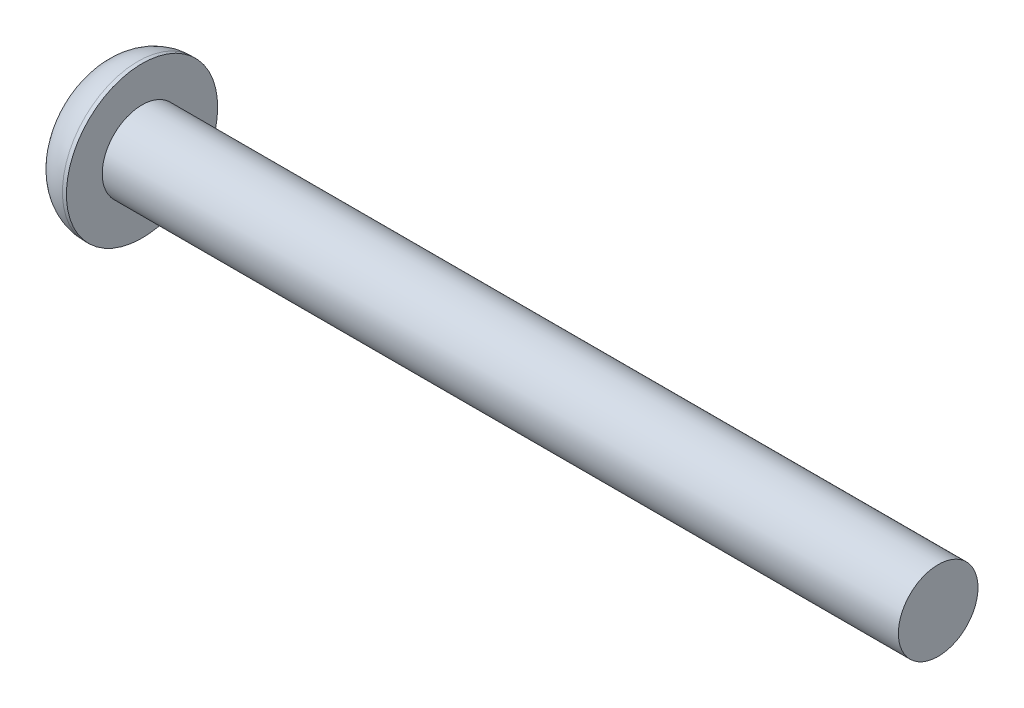
ISO-10303-21;
HEADER;
FILE_DESCRIPTION(('STEP AP214'),'2;1');
FILE_NAME('part.step','',(''),(''),'','','');
FILE_SCHEMA(('AUTOMOTIVE_DESIGN { 1 0 10303 214 1 1 1 1 }'));
ENDSEC;
DATA;
#1=APPLICATION_CONTEXT('core data for automotive mechanical design processes');
#2=APPLICATION_PROTOCOL_DEFINITION('international standard','automotive_design',2000,#1);
#3=PRODUCT_CONTEXT('',#1,'mechanical');
#4=PRODUCT('Part','Part','',(#3));
#5=PRODUCT_RELATED_PRODUCT_CATEGORY('part','',(#4));
#6=PRODUCT_DEFINITION_FORMATION('','',#4);
#7=PRODUCT_DEFINITION_CONTEXT('part definition',#1,'design');
#8=PRODUCT_DEFINITION('design','',#6,#7);
#9=PRODUCT_DEFINITION_SHAPE('','',#8);
#10=(LENGTH_UNIT() NAMED_UNIT(*) SI_UNIT(.MILLI.,.METRE.));
#11=(NAMED_UNIT(*) PLANE_ANGLE_UNIT() SI_UNIT($,.RADIAN.));
#12=(NAMED_UNIT(*) SI_UNIT($,.STERADIAN.) SOLID_ANGLE_UNIT());
#13=UNCERTAINTY_MEASURE_WITH_UNIT(LENGTH_MEASURE(1.E-05),#10,'distance_accuracy_value','');
#14=(GEOMETRIC_REPRESENTATION_CONTEXT(3) GLOBAL_UNCERTAINTY_ASSIGNED_CONTEXT((#13)) GLOBAL_UNIT_ASSIGNED_CONTEXT((#10,
#11,#12)) REPRESENTATION_CONTEXT('',''));
#15=CARTESIAN_POINT('',(0.,0.,0.));
#16=DIRECTION('',(0.,0.,1.));
#17=DIRECTION('',(1.,0.,0.));
#18=AXIS2_PLACEMENT_3D('',#15,#16,#17);
#19=CARTESIAN_POINT('',(0.,0.,-1.34999999999999));
#20=DIRECTION('',(-1.,0.,0.));
#21=DIRECTION('',(0.,0.,1.));
#22=AXIS2_PLACEMENT_3D('',#19,#20,#21);
#23=PLANE('',#22);
#24=DIRECTION('',(0.,0.866025403784439,0.5));
#25=VECTOR('',#24,1.);
#26=CARTESIAN_POINT('',(0.,-1.,0.577350269189626));
#27=LINE('',#26,#25);
#28=CARTESIAN_POINT('',(0.,-1.,0.577350269189626));
#29=VERTEX_POINT('',#28);
#30=CARTESIAN_POINT('',(0.,0.,1.15470053837925));
#31=VERTEX_POINT('',#30);
#32=EDGE_CURVE('E46',#29,#31,#27,.T.);
#33=ORIENTED_EDGE('',*,*,#32,.F.);
#34=DIRECTION('',(0.,0.,1.));
#35=VECTOR('',#34,1.);
#36=CARTESIAN_POINT('',(0.,-1.,-0.577350269189626));
#37=LINE('',#36,#35);
#38=CARTESIAN_POINT('',(0.,-1.,-0.577350269189626));
#39=VERTEX_POINT('',#38);
#40=EDGE_CURVE('E129',#39,#29,#37,.T.);
#41=ORIENTED_EDGE('',*,*,#40,.F.);
#42=DIRECTION('',(0.,-0.866025403784439,0.5));
#43=VECTOR('',#42,1.);
#44=CARTESIAN_POINT('',(0.,0.,-1.15470053837925));
#45=LINE('',#44,#43);
#46=CARTESIAN_POINT('',(0.,0.,-1.15470053837925));
#47=VERTEX_POINT('',#46);
#48=EDGE_CURVE('E127',#47,#39,#45,.T.);
#49=ORIENTED_EDGE('',*,*,#48,.F.);
#50=DIRECTION('',(0.,-0.866025403784439,-0.5));
#51=VECTOR('',#50,1.);
#52=CARTESIAN_POINT('',(0.,1.,-0.577350269189626));
#53=LINE('',#52,#51);
#54=CARTESIAN_POINT('',(0.,1.,-0.577350269189626));
#55=VERTEX_POINT('',#54);
#56=EDGE_CURVE('E94',#55,#47,#53,.T.);
#57=ORIENTED_EDGE('',*,*,#56,.F.);
#58=DIRECTION('',(0.,0.,-1.));
#59=VECTOR('',#58,1.);
#60=CARTESIAN_POINT('',(0.,1.,0.577350269189625));
#61=LINE('',#60,#59);
#62=CARTESIAN_POINT('',(0.,1.,0.577350269189625));
#63=VERTEX_POINT('',#62);
#64=EDGE_CURVE('E123',#63,#55,#61,.T.);
#65=ORIENTED_EDGE('',*,*,#64,.F.);
#66=DIRECTION('',(0.,0.866025403784439,-0.5));
#67=VECTOR('',#66,1.);
#68=CARTESIAN_POINT('',(0.,0.,1.15470053837925));
#69=LINE('',#68,#67);
#70=EDGE_CURVE('E120',#31,#63,#69,.T.);
#71=ORIENTED_EDGE('',*,*,#70,.F.);
#72=EDGE_LOOP('',(#33,#41,#49,#57,#65,#71));
#73=FACE_BOUND('',#72,.T.);
#74=CARTESIAN_POINT('',(0.,0.,0.));
#75=DIRECTION('',(1.,0.,0.));
#76=DIRECTION('',(0.,0.,-1.));
#77=AXIS2_PLACEMENT_3D('',#74,#75,#76);
#78=CIRCLE('',#77,1.34999999999999);
#79=CARTESIAN_POINT('',(0.,0.,-1.34999999999999));
#80=VERTEX_POINT('',#79);
#81=EDGE_CURVE('E11',#80,#80,#78,.T.);
#82=ORIENTED_EDGE('',*,*,#81,.F.);
#83=EDGE_LOOP('',(#82));
#84=FACE_BOUND('',#83,.T.);
#85=ADVANCED_FACE('F32',(#73,#84),#23,.T.);
#86=CARTESIAN_POINT('',(1.5,0.,0.));
#87=DIRECTION('',(1.,0.,0.));
#88=DIRECTION('',(0.,0.,-1.));
#89=AXIS2_PLACEMENT_3D('',#86,#87,#88);
#90=DEGENERATE_TOROIDAL_SURFACE('',#89,1.35,1.5,.T.);
#91=ORIENTED_EDGE('',*,*,#81,.T.);
#92=EDGE_LOOP('',(#91));
#93=FACE_BOUND('',#92,.T.);
#94=CARTESIAN_POINT('',(1.50000000000001,0.,0.));
#95=DIRECTION('',(1.,0.,0.));
#96=DIRECTION('',(0.,0.,-1.));
#97=AXIS2_PLACEMENT_3D('',#94,#95,#96);
#98=CIRCLE('',#97,2.85);
#99=CARTESIAN_POINT('',(1.50000000000001,0.,-2.85));
#100=VERTEX_POINT('',#99);
#101=EDGE_CURVE('E39',#100,#100,#98,.T.);
#102=ORIENTED_EDGE('',*,*,#101,.F.);
#103=EDGE_LOOP('',(#102));
#104=FACE_BOUND('',#103,.T.);
#105=ADVANCED_FACE('F152',(#93,#104),#90,.T.);
#106=CARTESIAN_POINT('',(0.,0.,0.));
#107=DIRECTION('',(1.,0.,0.));
#108=DIRECTION('',(0.,0.,-1.));
#109=AXIS2_PLACEMENT_3D('',#106,#107,#108);
#110=CYLINDRICAL_SURFACE('',#109,2.85);
#111=ORIENTED_EDGE('',*,*,#101,.T.);
#112=EDGE_LOOP('',(#111));
#113=FACE_BOUND('',#112,.T.);
#114=CARTESIAN_POINT('',(1.65,0.,0.));
#115=DIRECTION('',(1.,0.,0.));
#116=DIRECTION('',(0.,0.,-1.));
#117=AXIS2_PLACEMENT_3D('',#114,#115,#116);
#118=CIRCLE('',#117,2.85);
#119=CARTESIAN_POINT('',(1.65,0.,-2.85));
#120=VERTEX_POINT('',#119);
#121=EDGE_CURVE('E144',#120,#120,#118,.T.);
#122=ORIENTED_EDGE('',*,*,#121,.F.);
#123=EDGE_LOOP('',(#122));
#124=FACE_BOUND('',#123,.T.);
#125=ADVANCED_FACE('F149',(#113,#124),#110,.T.);
#126=CARTESIAN_POINT('',(1.65,0.,-1.5));
#127=DIRECTION('',(1.,0.,0.));
#128=DIRECTION('',(0.,0.,-1.));
#129=AXIS2_PLACEMENT_3D('',#126,#127,#128);
#130=PLANE('',#129);
#131=ORIENTED_EDGE('',*,*,#121,.T.);
#132=EDGE_LOOP('',(#131));
#133=FACE_BOUND('',#132,.T.);
#134=CARTESIAN_POINT('',(1.65,0.,0.));
#135=DIRECTION('',(1.,0.,0.));
#136=DIRECTION('',(0.,0.,-1.));
#137=AXIS2_PLACEMENT_3D('',#134,#135,#136);
#138=CIRCLE('',#137,1.5);
#139=CARTESIAN_POINT('',(1.65,0.,-1.5));
#140=VERTEX_POINT('',#139);
#141=EDGE_CURVE('E141',#140,#140,#138,.T.);
#142=ORIENTED_EDGE('',*,*,#141,.F.);
#143=EDGE_LOOP('',(#142));
#144=FACE_BOUND('',#143,.T.);
#145=ADVANCED_FACE('F159',(#133,#144),#130,.T.);
#146=CARTESIAN_POINT('',(0.,0.,0.));
#147=DIRECTION('',(1.,0.,0.));
#148=DIRECTION('',(0.,0.,-1.));
#149=AXIS2_PLACEMENT_3D('',#146,#147,#148);
#150=CYLINDRICAL_SURFACE('',#149,1.5);
#151=ORIENTED_EDGE('',*,*,#141,.T.);
#152=EDGE_LOOP('',(#151));
#153=FACE_BOUND('',#152,.T.);
#154=CARTESIAN_POINT('',(31.65,0.,0.));
#155=DIRECTION('',(1.,0.,0.));
#156=DIRECTION('',(0.,0.,-1.));
#157=AXIS2_PLACEMENT_3D('',#154,#155,#156);
#158=CIRCLE('',#157,1.5);
#159=CARTESIAN_POINT('',(31.65,0.,-1.5));
#160=VERTEX_POINT('',#159);
#161=EDGE_CURVE('E133',#160,#160,#158,.T.);
#162=ORIENTED_EDGE('',*,*,#161,.F.);
#163=EDGE_LOOP('',(#162));
#164=FACE_BOUND('',#163,.T.);
#165=ADVANCED_FACE('F165',(#153,#164),#150,.T.);
#166=CARTESIAN_POINT('',(31.65,0.,0.));
#167=DIRECTION('',(1.,0.,0.));
#168=DIRECTION('',(0.,0.,-1.));
#169=AXIS2_PLACEMENT_3D('',#166,#167,#168);
#170=PLANE('',#169);
#171=ORIENTED_EDGE('',*,*,#161,.T.);
#172=EDGE_LOOP('',(#171));
#173=FACE_BOUND('',#172,.T.);
#174=ADVANCED_FACE('F169',(#173),#170,.T.);
#175=CARTESIAN_POINT('',(1.04,-1.,0.577350269189626));
#176=DIRECTION('',(0.,-0.5,0.866025403784439));
#177=DIRECTION('',(0.,-0.866025403784439,-0.5));
#178=AXIS2_PLACEMENT_3D('',#175,#176,#177);
#179=PLANE('',#178);
#180=ORIENTED_EDGE('',*,*,#32,.T.);
#181=DIRECTION('',(-1.,0.,0.));
#182=VECTOR('',#181,1.);
#183=CARTESIAN_POINT('',(1.04,0.,1.15470053837925));
#184=LINE('',#183,#182);
#185=CARTESIAN_POINT('',(1.04,0.,1.15470053837925));
#186=VERTEX_POINT('',#185);
#187=EDGE_CURVE('E76',#186,#31,#184,.T.);
#188=ORIENTED_EDGE('',*,*,#187,.F.);
#189=DIRECTION('',(0.,0.866025403784439,0.5));
#190=VECTOR('',#189,1.);
#191=CARTESIAN_POINT('',(1.04,-1.,0.577350269189626));
#192=LINE('',#191,#190);
#193=CARTESIAN_POINT('',(1.04,-1.,0.577350269189626));
#194=VERTEX_POINT('',#193);
#195=EDGE_CURVE('E131',#194,#186,#192,.T.);
#196=ORIENTED_EDGE('',*,*,#195,.F.);
#197=DIRECTION('',(-1.,0.,0.));
#198=VECTOR('',#197,1.);
#199=CARTESIAN_POINT('',(1.04,-1.,0.577350269189626));
#200=LINE('',#199,#198);
#201=EDGE_CURVE('E54',#194,#29,#200,.T.);
#202=ORIENTED_EDGE('',*,*,#201,.T.);
#203=EDGE_LOOP('',(#180,#188,#196,#202));
#204=FACE_BOUND('',#203,.T.);
#205=ADVANCED_FACE('F173',(#204),#179,.F.);
#206=CARTESIAN_POINT('',(1.04,-1.,-0.577350269189626));
#207=DIRECTION('',(0.,-1.,0.));
#208=DIRECTION('',(0.,0.,-1.));
#209=AXIS2_PLACEMENT_3D('',#206,#207,#208);
#210=PLANE('',#209);
#211=ORIENTED_EDGE('',*,*,#40,.T.);
#212=ORIENTED_EDGE('',*,*,#201,.F.);
#213=DIRECTION('',(0.,0.,1.));
#214=VECTOR('',#213,1.);
#215=CARTESIAN_POINT('',(1.04,-1.,-0.577350269189626));
#216=LINE('',#215,#214);
#217=CARTESIAN_POINT('',(1.04,-1.,-0.577350269189626));
#218=VERTEX_POINT('',#217);
#219=EDGE_CURVE('E106',#218,#194,#216,.T.);
#220=ORIENTED_EDGE('',*,*,#219,.F.);
#221=DIRECTION('',(-1.,0.,0.));
#222=VECTOR('',#221,1.);
#223=CARTESIAN_POINT('',(1.04,-1.,-0.577350269189626));
#224=LINE('',#223,#222);
#225=EDGE_CURVE('E98',#218,#39,#224,.T.);
#226=ORIENTED_EDGE('',*,*,#225,.T.);
#227=EDGE_LOOP('',(#211,#212,#220,#226));
#228=FACE_BOUND('',#227,.T.);
#229=ADVANCED_FACE('F177',(#228),#210,.F.);
#230=CARTESIAN_POINT('',(1.04,0.,-1.15470053837925));
#231=DIRECTION('',(0.,-0.5,-0.866025403784439));
#232=DIRECTION('',(0.,0.866025403784439,-0.5));
#233=AXIS2_PLACEMENT_3D('',#230,#231,#232);
#234=PLANE('',#233);
#235=ORIENTED_EDGE('',*,*,#48,.T.);
#236=ORIENTED_EDGE('',*,*,#225,.F.);
#237=DIRECTION('',(0.,-0.866025403784439,0.5));
#238=VECTOR('',#237,1.);
#239=CARTESIAN_POINT('',(1.04,0.,-1.15470053837925));
#240=LINE('',#239,#238);
#241=CARTESIAN_POINT('',(1.04,0.,-1.15470053837925));
#242=VERTEX_POINT('',#241);
#243=EDGE_CURVE('E102',#242,#218,#240,.T.);
#244=ORIENTED_EDGE('',*,*,#243,.F.);
#245=DIRECTION('',(-1.,0.,0.));
#246=VECTOR('',#245,1.);
#247=CARTESIAN_POINT('',(1.04,0.,-1.15470053837925));
#248=LINE('',#247,#246);
#249=EDGE_CURVE('E87',#242,#47,#248,.T.);
#250=ORIENTED_EDGE('',*,*,#249,.T.);
#251=EDGE_LOOP('',(#235,#236,#244,#250));
#252=FACE_BOUND('',#251,.T.);
#253=ADVANCED_FACE('F103',(#252),#234,.F.);
#254=CARTESIAN_POINT('',(1.04,1.,-0.577350269189626));
#255=DIRECTION('',(0.,0.5,-0.866025403784439));
#256=DIRECTION('',(0.,0.866025403784439,0.5));
#257=AXIS2_PLACEMENT_3D('',#254,#255,#256);
#258=PLANE('',#257);
#259=ORIENTED_EDGE('',*,*,#56,.T.);
#260=ORIENTED_EDGE('',*,*,#249,.F.);
#261=DIRECTION('',(0.,-0.866025403784439,-0.5));
#262=VECTOR('',#261,1.);
#263=CARTESIAN_POINT('',(1.04,1.,-0.577350269189626));
#264=LINE('',#263,#262);
#265=CARTESIAN_POINT('',(1.04,1.,-0.577350269189626));
#266=VERTEX_POINT('',#265);
#267=EDGE_CURVE('E91',#266,#242,#264,.T.);
#268=ORIENTED_EDGE('',*,*,#267,.F.);
#269=DIRECTION('',(-1.,0.,0.));
#270=VECTOR('',#269,1.);
#271=CARTESIAN_POINT('',(1.04,1.,-0.577350269189626));
#272=LINE('',#271,#270);
#273=EDGE_CURVE('E99',#266,#55,#272,.T.);
#274=ORIENTED_EDGE('',*,*,#273,.T.);
#275=EDGE_LOOP('',(#259,#260,#268,#274));
#276=FACE_BOUND('',#275,.T.);
#277=ADVANCED_FACE('F89',(#276),#258,.F.);
#278=CARTESIAN_POINT('',(1.04,1.,0.577350269189625));
#279=DIRECTION('',(0.,1.,0.));
#280=DIRECTION('',(0.,0.,1.));
#281=AXIS2_PLACEMENT_3D('',#278,#279,#280);
#282=PLANE('',#281);
#283=ORIENTED_EDGE('',*,*,#64,.T.);
#284=ORIENTED_EDGE('',*,*,#273,.F.);
#285=DIRECTION('',(0.,0.,-1.));
#286=VECTOR('',#285,1.);
#287=CARTESIAN_POINT('',(1.04,1.,0.577350269189625));
#288=LINE('',#287,#286);
#289=CARTESIAN_POINT('',(1.04,1.,0.577350269189625));
#290=VERTEX_POINT('',#289);
#291=EDGE_CURVE('E112',#290,#266,#288,.T.);
#292=ORIENTED_EDGE('',*,*,#291,.F.);
#293=DIRECTION('',(-1.,0.,0.));
#294=VECTOR('',#293,1.);
#295=CARTESIAN_POINT('',(1.04,1.,0.577350269189625));
#296=LINE('',#295,#294);
#297=EDGE_CURVE('E136',#290,#63,#296,.T.);
#298=ORIENTED_EDGE('',*,*,#297,.T.);
#299=EDGE_LOOP('',(#283,#284,#292,#298));
#300=FACE_BOUND('',#299,.T.);
#301=ADVANCED_FACE('F181',(#300),#282,.F.);
#302=CARTESIAN_POINT('',(1.04,0.,1.15470053837925));
#303=DIRECTION('',(0.,0.5,0.866025403784439));
#304=DIRECTION('',(0.,-0.866025403784439,0.5));
#305=AXIS2_PLACEMENT_3D('',#302,#303,#304);
#306=PLANE('',#305);
#307=ORIENTED_EDGE('',*,*,#70,.T.);
#308=ORIENTED_EDGE('',*,*,#297,.F.);
#309=DIRECTION('',(0.,0.866025403784439,-0.5));
#310=VECTOR('',#309,1.);
#311=CARTESIAN_POINT('',(1.04,0.,1.15470053837925));
#312=LINE('',#311,#310);
#313=EDGE_CURVE('E114',#186,#290,#312,.T.);
#314=ORIENTED_EDGE('',*,*,#313,.F.);
#315=ORIENTED_EDGE('',*,*,#187,.T.);
#316=EDGE_LOOP('',(#307,#308,#314,#315));
#317=FACE_BOUND('',#316,.T.);
#318=ADVANCED_FACE('F178',(#317),#306,.F.);
#319=CARTESIAN_POINT('',(1.04,0.,0.));
#320=DIRECTION('',(-1.,0.,0.));
#321=DIRECTION('',(0.,0.,1.));
#322=AXIS2_PLACEMENT_3D('',#319,#320,#321);
#323=PLANE('',#322);
#324=ORIENTED_EDGE('',*,*,#195,.T.);
#325=ORIENTED_EDGE('',*,*,#313,.T.);
#326=ORIENTED_EDGE('',*,*,#291,.T.);
#327=ORIENTED_EDGE('',*,*,#267,.T.);
#328=ORIENTED_EDGE('',*,*,#243,.T.);
#329=ORIENTED_EDGE('',*,*,#219,.T.);
#330=EDGE_LOOP('',(#324,#325,#326,#327,#328,#329));
#331=FACE_BOUND('',#330,.T.);
#332=ADVANCED_FACE('F109',(#331),#323,.T.);
#333=CLOSED_SHELL('',(#85,#105,#125,#145,#165,#174,#205,#229,#253,#277,#301,#318,#332));
#334=MANIFOLD_SOLID_BREP('B2',#333);
#335=ADVANCED_BREP_SHAPE_REPRESENTATION('',(#18,#334),#14);
#336=SHAPE_DEFINITION_REPRESENTATION(#9,#335);
ENDSEC;
END-ISO-10303-21;
